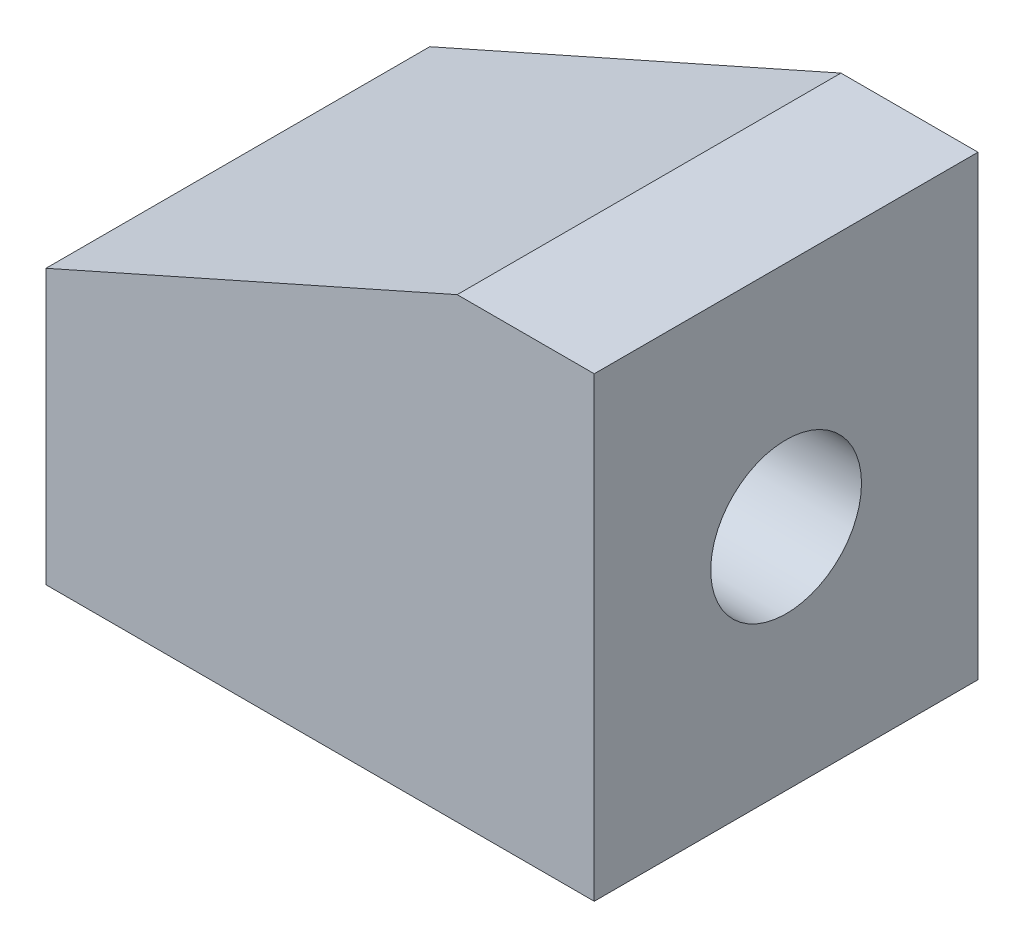
ISO-10303-21;
HEADER;
FILE_DESCRIPTION(('STEP AP214'),'2;1');
FILE_NAME('part.step','',(''),(''),'','','');
FILE_SCHEMA(('AUTOMOTIVE_DESIGN { 1 0 10303 214 1 1 1 1 }'));
ENDSEC;
DATA;
#1=APPLICATION_CONTEXT('core data for automotive mechanical design processes');
#2=APPLICATION_PROTOCOL_DEFINITION('international standard','automotive_design',2000,#1);
#3=PRODUCT_CONTEXT('',#1,'mechanical');
#4=PRODUCT('Part','Part','',(#3));
#5=PRODUCT_RELATED_PRODUCT_CATEGORY('part','',(#4));
#6=PRODUCT_DEFINITION_FORMATION('','',#4);
#7=PRODUCT_DEFINITION_CONTEXT('part definition',#1,'design');
#8=PRODUCT_DEFINITION('design','',#6,#7);
#9=PRODUCT_DEFINITION_SHAPE('','',#8);
#10=(LENGTH_UNIT() NAMED_UNIT(*) SI_UNIT(.MILLI.,.METRE.));
#11=(NAMED_UNIT(*) PLANE_ANGLE_UNIT() SI_UNIT($,.RADIAN.));
#12=(NAMED_UNIT(*) SI_UNIT($,.STERADIAN.) SOLID_ANGLE_UNIT());
#13=UNCERTAINTY_MEASURE_WITH_UNIT(LENGTH_MEASURE(1.E-05),#10,'distance_accuracy_value','');
#14=(GEOMETRIC_REPRESENTATION_CONTEXT(3) GLOBAL_UNCERTAINTY_ASSIGNED_CONTEXT((#13)) GLOBAL_UNIT_ASSIGNED_CONTEXT((#10,
#11,#12)) REPRESENTATION_CONTEXT('',''));
#15=CARTESIAN_POINT('',(0.,0.,0.));
#16=DIRECTION('',(0.,0.,1.));
#17=DIRECTION('',(1.,0.,0.));
#18=AXIS2_PLACEMENT_3D('',#15,#16,#17);
#19=CARTESIAN_POINT('',(-30.,-15.,42.));
#20=DIRECTION('',(1.,0.,0.));
#21=DIRECTION('',(0.,0.,-1.));
#22=AXIS2_PLACEMENT_3D('',#19,#20,#21);
#23=PLANE('',#22);
#24=DIRECTION('',(0.,-1.,0.));
#25=VECTOR('',#24,1.);
#26=CARTESIAN_POINT('',(-30.,-15.,0.));
#27=LINE('',#26,#25);
#28=CARTESIAN_POINT('',(-30.,15.,0.));
#29=VERTEX_POINT('',#28);
#30=CARTESIAN_POINT('',(-30.,-15.,0.));
#31=VERTEX_POINT('',#30);
#32=EDGE_CURVE('E123',#29,#31,#27,.T.);
#33=ORIENTED_EDGE('',*,*,#32,.T.);
#34=DIRECTION('',(0.,0.,-1.));
#35=VECTOR('',#34,1.);
#36=CARTESIAN_POINT('',(-30.,-15.,42.));
#37=LINE('',#36,#35);
#38=CARTESIAN_POINT('',(-30.,-15.,42.));
#39=VERTEX_POINT('',#38);
#40=EDGE_CURVE('E11',#39,#31,#37,.T.);
#41=ORIENTED_EDGE('',*,*,#40,.F.);
#42=DIRECTION('',(0.,-1.,0.));
#43=VECTOR('',#42,1.);
#44=CARTESIAN_POINT('',(-30.,-15.,42.));
#45=LINE('',#44,#43);
#46=CARTESIAN_POINT('',(-30.,15.,42.));
#47=VERTEX_POINT('',#46);
#48=EDGE_CURVE('E137',#47,#39,#45,.T.);
#49=ORIENTED_EDGE('',*,*,#48,.F.);
#50=DIRECTION('',(0.,0.,-1.));
#51=VECTOR('',#50,1.);
#52=CARTESIAN_POINT('',(-30.,15.,42.));
#53=LINE('',#52,#51);
#54=EDGE_CURVE('E119',#47,#29,#53,.T.);
#55=ORIENTED_EDGE('',*,*,#54,.T.);
#56=EDGE_LOOP('',(#33,#41,#49,#55));
#57=FACE_BOUND('',#56,.T.);
#58=ADVANCED_FACE('F42',(#57),#23,.F.);
#59=CARTESIAN_POINT('',(-30.,-15.,42.));
#60=DIRECTION('',(0.,1.,0.));
#61=DIRECTION('',(-1.,0.,0.));
#62=AXIS2_PLACEMENT_3D('',#59,#60,#61);
#63=PLANE('',#62);
#64=DIRECTION('',(1.,0.,0.));
#65=VECTOR('',#64,1.);
#66=CARTESIAN_POINT('',(-30.,-15.,0.));
#67=LINE('',#66,#65);
#68=CARTESIAN_POINT('',(30.,-15.,0.));
#69=VERTEX_POINT('',#68);
#70=EDGE_CURVE('E127',#31,#69,#67,.T.);
#71=ORIENTED_EDGE('',*,*,#70,.T.);
#72=DIRECTION('',(0.,0.,-1.));
#73=VECTOR('',#72,1.);
#74=CARTESIAN_POINT('',(30.,-15.,42.));
#75=LINE('',#74,#73);
#76=CARTESIAN_POINT('',(30.,-15.,42.));
#77=VERTEX_POINT('',#76);
#78=EDGE_CURVE('E51',#77,#69,#75,.T.);
#79=ORIENTED_EDGE('',*,*,#78,.F.);
#80=DIRECTION('',(1.,0.,0.));
#81=VECTOR('',#80,1.);
#82=CARTESIAN_POINT('',(-30.,-15.,42.));
#83=LINE('',#82,#81);
#84=EDGE_CURVE('E94',#39,#77,#83,.T.);
#85=ORIENTED_EDGE('',*,*,#84,.F.);
#86=ORIENTED_EDGE('',*,*,#40,.T.);
#87=EDGE_LOOP('',(#71,#79,#85,#86));
#88=FACE_BOUND('',#87,.T.);
#89=ADVANCED_FACE('F159',(#88),#63,.F.);
#90=CARTESIAN_POINT('',(30.,35.,42.));
#91=DIRECTION('',(-1.,0.,0.));
#92=DIRECTION('',(0.,-1.,0.));
#93=AXIS2_PLACEMENT_3D('',#90,#91,#92);
#94=PLANE('',#93);
#95=CARTESIAN_POINT('',(30.,10.,21.));
#96=DIRECTION('',(1.,0.,0.));
#97=DIRECTION('',(0.,0.,-1.));
#98=AXIS2_PLACEMENT_3D('',#95,#96,#97);
#99=CIRCLE('',#98,8.24999999999999);
#100=CARTESIAN_POINT('',(30.,10.,12.75));
#101=VERTEX_POINT('',#100);
#102=EDGE_CURVE('E174',#101,#101,#99,.T.);
#103=ORIENTED_EDGE('',*,*,#102,.F.);
#104=EDGE_LOOP('',(#103));
#105=FACE_BOUND('',#104,.T.);
#106=DIRECTION('',(0.,1.,0.));
#107=VECTOR('',#106,1.);
#108=CARTESIAN_POINT('',(30.,35.,0.));
#109=LINE('',#108,#107);
#110=CARTESIAN_POINT('',(30.,35.,0.));
#111=VERTEX_POINT('',#110);
#112=EDGE_CURVE('E111',#69,#111,#109,.T.);
#113=ORIENTED_EDGE('',*,*,#112,.T.);
#114=DIRECTION('',(0.,0.,-1.));
#115=VECTOR('',#114,1.);
#116=CARTESIAN_POINT('',(30.,35.,42.));
#117=LINE('',#116,#115);
#118=CARTESIAN_POINT('',(30.,35.,42.));
#119=VERTEX_POINT('',#118);
#120=EDGE_CURVE('E108',#119,#111,#117,.T.);
#121=ORIENTED_EDGE('',*,*,#120,.F.);
#122=DIRECTION('',(0.,1.,0.));
#123=VECTOR('',#122,1.);
#124=CARTESIAN_POINT('',(30.,35.,42.));
#125=LINE('',#124,#123);
#126=EDGE_CURVE('E99',#77,#119,#125,.T.);
#127=ORIENTED_EDGE('',*,*,#126,.F.);
#128=ORIENTED_EDGE('',*,*,#78,.T.);
#129=EDGE_LOOP('',(#113,#121,#127,#128));
#130=FACE_BOUND('',#129,.T.);
#131=ADVANCED_FACE('F109',(#105,#130),#94,.F.);
#132=CARTESIAN_POINT('',(15.,35.,42.));
#133=DIRECTION('',(0.,-1.,0.));
#134=DIRECTION('',(0.,0.,-1.));
#135=AXIS2_PLACEMENT_3D('',#132,#133,#134);
#136=PLANE('',#135);
#137=DIRECTION('',(-1.,0.,0.));
#138=VECTOR('',#137,1.);
#139=CARTESIAN_POINT('',(15.,35.,0.));
#140=LINE('',#139,#138);
#141=CARTESIAN_POINT('',(15.,35.,0.));
#142=VERTEX_POINT('',#141);
#143=EDGE_CURVE('E80',#111,#142,#140,.T.);
#144=ORIENTED_EDGE('',*,*,#143,.T.);
#145=DIRECTION('',(0.,0.,-1.));
#146=VECTOR('',#145,1.);
#147=CARTESIAN_POINT('',(15.,35.,42.));
#148=LINE('',#147,#146);
#149=CARTESIAN_POINT('',(15.,35.,42.));
#150=VERTEX_POINT('',#149);
#151=EDGE_CURVE('E113',#150,#142,#148,.T.);
#152=ORIENTED_EDGE('',*,*,#151,.F.);
#153=DIRECTION('',(-1.,0.,0.));
#154=VECTOR('',#153,1.);
#155=CARTESIAN_POINT('',(15.,35.,42.));
#156=LINE('',#155,#154);
#157=EDGE_CURVE('E103',#119,#150,#156,.T.);
#158=ORIENTED_EDGE('',*,*,#157,.F.);
#159=ORIENTED_EDGE('',*,*,#120,.T.);
#160=EDGE_LOOP('',(#144,#152,#158,#159));
#161=FACE_BOUND('',#160,.T.);
#162=ADVANCED_FACE('F115',(#161),#136,.F.);
#163=CARTESIAN_POINT('',(-30.,15.,42.));
#164=DIRECTION('',(0.406138466053448,-0.913811548620257,0.));
#165=DIRECTION('',(0.913811548620257,0.406138466053448,0.));
#166=AXIS2_PLACEMENT_3D('',#163,#164,#165);
#167=PLANE('',#166);
#168=DIRECTION('',(-0.913811548620257,-0.406138466053448,0.));
#169=VECTOR('',#168,1.);
#170=CARTESIAN_POINT('',(-30.,15.,0.));
#171=LINE('',#170,#169);
#172=EDGE_CURVE('E86',#142,#29,#171,.T.);
#173=ORIENTED_EDGE('',*,*,#172,.T.);
#174=ORIENTED_EDGE('',*,*,#54,.F.);
#175=DIRECTION('',(-0.913811548620257,-0.406138466053448,0.));
#176=VECTOR('',#175,1.);
#177=CARTESIAN_POINT('',(-30.,15.,42.));
#178=LINE('',#177,#176);
#179=EDGE_CURVE('E59',#150,#47,#178,.T.);
#180=ORIENTED_EDGE('',*,*,#179,.F.);
#181=ORIENTED_EDGE('',*,*,#151,.T.);
#182=EDGE_LOOP('',(#173,#174,#180,#181));
#183=FACE_BOUND('',#182,.T.);
#184=ADVANCED_FACE('F148',(#183),#167,.F.);
#185=CARTESIAN_POINT('',(0.,0.,42.));
#186=DIRECTION('',(0.,0.,-1.));
#187=DIRECTION('',(-1.,0.,0.));
#188=AXIS2_PLACEMENT_3D('',#185,#186,#187);
#189=PLANE('',#188);
#190=ORIENTED_EDGE('',*,*,#48,.T.);
#191=ORIENTED_EDGE('',*,*,#84,.T.);
#192=ORIENTED_EDGE('',*,*,#126,.T.);
#193=ORIENTED_EDGE('',*,*,#157,.T.);
#194=ORIENTED_EDGE('',*,*,#179,.T.);
#195=EDGE_LOOP('',(#190,#191,#192,#193,#194));
#196=FACE_BOUND('',#195,.T.);
#197=ADVANCED_FACE('F101',(#196),#189,.F.);
#198=CARTESIAN_POINT('',(0.,0.,0.));
#199=DIRECTION('',(0.,0.,-1.));
#200=DIRECTION('',(-1.,0.,0.));
#201=AXIS2_PLACEMENT_3D('',#198,#199,#200);
#202=PLANE('',#201);
#203=ORIENTED_EDGE('',*,*,#32,.F.);
#204=ORIENTED_EDGE('',*,*,#172,.F.);
#205=ORIENTED_EDGE('',*,*,#143,.F.);
#206=ORIENTED_EDGE('',*,*,#112,.F.);
#207=ORIENTED_EDGE('',*,*,#70,.F.);
#208=EDGE_LOOP('',(#203,#204,#205,#206,#207));
#209=FACE_BOUND('',#208,.T.);
#210=ADVANCED_FACE('F144',(#209),#202,.T.);
#211=CARTESIAN_POINT('',(-13.5,10.,21.));
#212=DIRECTION('',(1.,0.,0.));
#213=DIRECTION('',(0.,0.,-1.));
#214=AXIS2_PLACEMENT_3D('',#211,#212,#213);
#215=CONICAL_SURFACE('',#214,8.24999999999999,1.02974425867665);
#216=CARTESIAN_POINT('',(-18.4571001069774,9.99999999999999,21.));
#217=VERTEX_POINT('',#216);
#218=VERTEX_LOOP('',#217);
#219=FACE_BOUND('',#218,.T.);
#220=CARTESIAN_POINT('',(-13.5,10.,21.));
#221=DIRECTION('',(1.,0.,0.));
#222=DIRECTION('',(0.,0.,-1.));
#223=AXIS2_PLACEMENT_3D('',#220,#221,#222);
#224=CIRCLE('',#223,8.24999999999999);
#225=CARTESIAN_POINT('',(-13.5,10.,12.75));
#226=VERTEX_POINT('',#225);
#227=EDGE_CURVE('E128',#226,#226,#224,.T.);
#228=ORIENTED_EDGE('',*,*,#227,.T.);
#229=EDGE_LOOP('',(#228));
#230=FACE_BOUND('',#229,.T.);
#231=ADVANCED_FACE('F186',(#219,#230),#215,.F.);
#232=CARTESIAN_POINT('',(30.,10.,21.));
#233=DIRECTION('',(1.,0.,0.));
#234=DIRECTION('',(0.,0.,-1.));
#235=AXIS2_PLACEMENT_3D('',#232,#233,#234);
#236=CYLINDRICAL_SURFACE('',#235,8.24999999999999);
#237=ORIENTED_EDGE('',*,*,#227,.F.);
#238=EDGE_LOOP('',(#237));
#239=FACE_BOUND('',#238,.T.);
#240=ORIENTED_EDGE('',*,*,#102,.T.);
#241=EDGE_LOOP('',(#240));
#242=FACE_BOUND('',#241,.T.);
#243=ADVANCED_FACE('F188',(#239,#242),#236,.F.);
#244=CLOSED_SHELL('',(#58,#89,#131,#162,#184,#197,#210,#231,#243));
#245=MANIFOLD_SOLID_BREP('B2',#244);
#246=ADVANCED_BREP_SHAPE_REPRESENTATION('',(#18,#245),#14);
#247=SHAPE_DEFINITION_REPRESENTATION(#9,#246);
ENDSEC;
END-ISO-10303-21;
